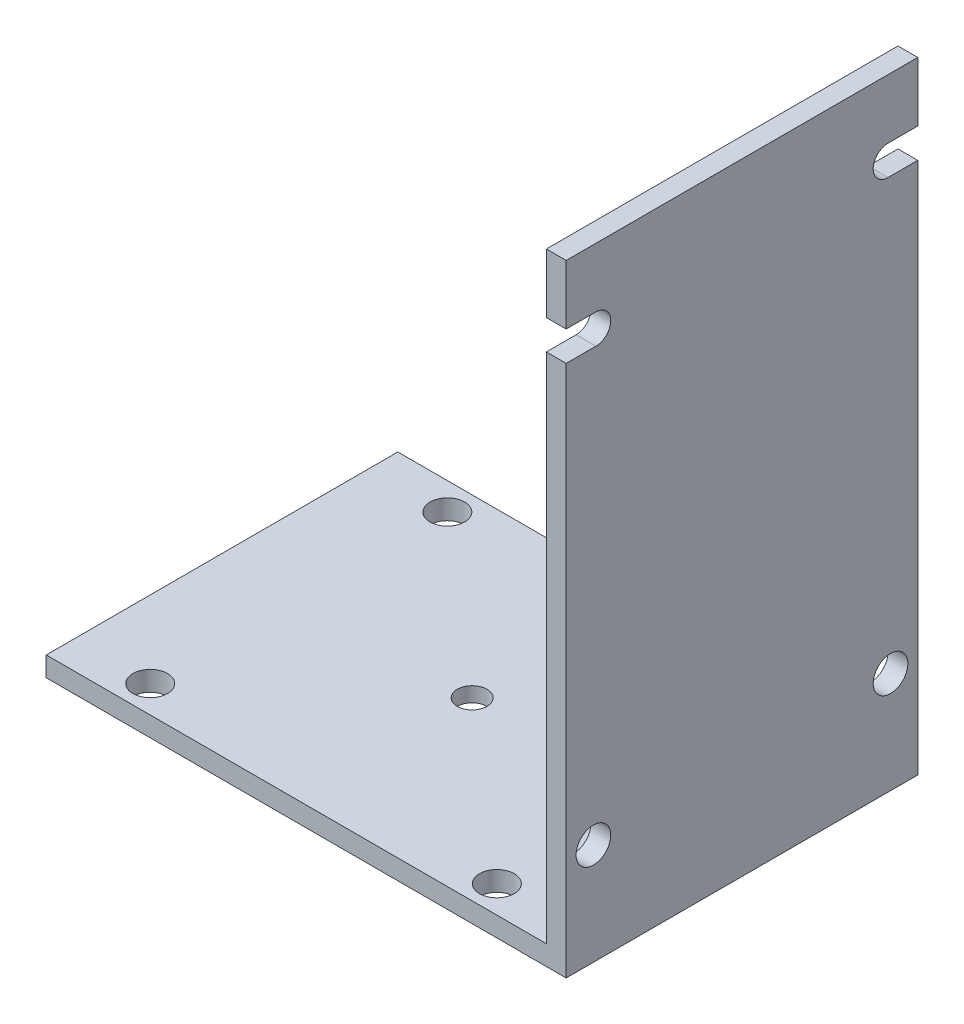
ISO-10303-21;
HEADER;
FILE_DESCRIPTION(('STEP AP214'),'2;1');
FILE_NAME('part.step','',(''),(''),'','','');
FILE_SCHEMA(('AUTOMOTIVE_DESIGN { 1 0 10303 214 1 1 1 1 }'));
ENDSEC;
DATA;
#1=APPLICATION_CONTEXT('core data for automotive mechanical design processes');
#2=APPLICATION_PROTOCOL_DEFINITION('international standard','automotive_design',2000,#1);
#3=PRODUCT_CONTEXT('',#1,'mechanical');
#4=PRODUCT('Part','Part','',(#3));
#5=PRODUCT_RELATED_PRODUCT_CATEGORY('part','',(#4));
#6=PRODUCT_DEFINITION_FORMATION('','',#4);
#7=PRODUCT_DEFINITION_CONTEXT('part definition',#1,'design');
#8=PRODUCT_DEFINITION('design','',#6,#7);
#9=PRODUCT_DEFINITION_SHAPE('','',#8);
#10=(LENGTH_UNIT() NAMED_UNIT(*) SI_UNIT(.MILLI.,.METRE.));
#11=(NAMED_UNIT(*) PLANE_ANGLE_UNIT() SI_UNIT($,.RADIAN.));
#12=(NAMED_UNIT(*) SI_UNIT($,.STERADIAN.) SOLID_ANGLE_UNIT());
#13=UNCERTAINTY_MEASURE_WITH_UNIT(LENGTH_MEASURE(1.E-05),#10,'distance_accuracy_value','');
#14=(GEOMETRIC_REPRESENTATION_CONTEXT(3) GLOBAL_UNCERTAINTY_ASSIGNED_CONTEXT((#13)) GLOBAL_UNIT_ASSIGNED_CONTEXT((#10,
#11,#12)) REPRESENTATION_CONTEXT('',''));
#15=CARTESIAN_POINT('',(0.,0.,0.));
#16=DIRECTION('',(0.,0.,1.));
#17=DIRECTION('',(1.,0.,0.));
#18=AXIS2_PLACEMENT_3D('',#15,#16,#17);
#19=CARTESIAN_POINT('',(5.22062774814458,-8.48528137423857,0.500000000000007));
#20=DIRECTION('',(0.,1.,0.));
#21=DIRECTION('',(0.,0.,1.));
#22=AXIS2_PLACEMENT_3D('',#19,#20,#21);
#23=CYLINDRICAL_SURFACE('',#22,3.);
#24=CARTESIAN_POINT('',(5.22062774814458,4.,0.500000000000007));
#25=DIRECTION('',(0.,1.,0.));
#26=DIRECTION('',(0.,0.,1.));
#27=AXIS2_PLACEMENT_3D('',#24,#25,#26);
#28=CIRCLE('',#27,3.);
#29=CARTESIAN_POINT('',(5.22062774814458,4.,3.50000000000001));
#30=VERTEX_POINT('',#29);
#31=EDGE_CURVE('E357',#30,#30,#28,.T.);
#32=CARTESIAN_POINT('',(5.22062774814458,1.,0.500000000000007));
#33=DIRECTION('',(0.,-1.,0.));
#34=DIRECTION('',(0.,0.,-1.));
#35=AXIS2_PLACEMENT_3D('',#32,#33,#34);
#36=CIRCLE('',#35,3.);
#37=CARTESIAN_POINT('',(5.22062774814458,1.,3.50000000000001));
#38=VERTEX_POINT('',#37);
#39=EDGE_CURVE('E45',#38,#38,#36,.F.);
#40=CARTESIAN_POINT('',(5.22062774814458,4.,3.50000000000001));
#41=CARTESIAN_POINT('',(5.22062774814458,3.96875,3.50000000000001));
#42=CARTESIAN_POINT('',(5.22062774814458,3.9375,3.50000000000001));
#43=CARTESIAN_POINT('',(5.22062774814458,3.875,3.50000000000001));
#44=CARTESIAN_POINT('',(5.22062774814458,3.84375,3.50000000000001));
#45=CARTESIAN_POINT('',(5.22062774814458,3.78125,3.50000000000001));
#46=CARTESIAN_POINT('',(5.22062774814458,3.75,3.50000000000001));
#47=CARTESIAN_POINT('',(5.22062774814458,3.6875,3.50000000000001));
#48=CARTESIAN_POINT('',(5.22062774814458,3.65625,3.50000000000001));
#49=CARTESIAN_POINT('',(5.22062774814458,3.59375,3.50000000000001));
#50=CARTESIAN_POINT('',(5.22062774814458,3.5625,3.50000000000001));
#51=CARTESIAN_POINT('',(5.22062774814458,3.5,3.50000000000001));
#52=CARTESIAN_POINT('',(5.22062774814458,3.46875,3.50000000000001));
#53=CARTESIAN_POINT('',(5.22062774814458,3.40625,3.50000000000001));
#54=CARTESIAN_POINT('',(5.22062774814458,3.375,3.50000000000001));
#55=CARTESIAN_POINT('',(5.22062774814458,3.3125,3.50000000000001));
#56=CARTESIAN_POINT('',(5.22062774814458,3.28125,3.50000000000001));
#57=CARTESIAN_POINT('',(5.22062774814458,3.21875,3.50000000000001));
#58=CARTESIAN_POINT('',(5.22062774814458,3.1875,3.50000000000001));
#59=CARTESIAN_POINT('',(5.22062774814458,3.125,3.50000000000001));
#60=CARTESIAN_POINT('',(5.22062774814458,3.09375,3.50000000000001));
#61=CARTESIAN_POINT('',(5.22062774814458,3.03125,3.50000000000001));
#62=CARTESIAN_POINT('',(5.22062774814458,3.,3.50000000000001));
#63=CARTESIAN_POINT('',(5.22062774814458,2.9375,3.50000000000001));
#64=CARTESIAN_POINT('',(5.22062774814458,2.90625,3.50000000000001));
#65=CARTESIAN_POINT('',(5.22062774814458,2.84375,3.50000000000001));
#66=CARTESIAN_POINT('',(5.22062774814458,2.8125,3.50000000000001));
#67=CARTESIAN_POINT('',(5.22062774814458,2.75,3.50000000000001));
#68=CARTESIAN_POINT('',(5.22062774814458,2.71875,3.50000000000001));
#69=CARTESIAN_POINT('',(5.22062774814458,2.65625,3.50000000000001));
#70=CARTESIAN_POINT('',(5.22062774814458,2.625,3.50000000000001));
#71=CARTESIAN_POINT('',(5.22062774814458,2.5625,3.50000000000001));
#72=CARTESIAN_POINT('',(5.22062774814458,2.53125,3.50000000000001));
#73=CARTESIAN_POINT('',(5.22062774814458,2.46875,3.50000000000001));
#74=CARTESIAN_POINT('',(5.22062774814458,2.4375,3.50000000000001));
#75=CARTESIAN_POINT('',(5.22062774814458,2.375,3.50000000000001));
#76=CARTESIAN_POINT('',(5.22062774814458,2.34375,3.50000000000001));
#77=CARTESIAN_POINT('',(5.22062774814458,2.28125,3.50000000000001));
#78=CARTESIAN_POINT('',(5.22062774814458,2.25,3.50000000000001));
#79=CARTESIAN_POINT('',(5.22062774814458,2.1875,3.50000000000001));
#80=CARTESIAN_POINT('',(5.22062774814458,2.15625,3.50000000000001));
#81=CARTESIAN_POINT('',(5.22062774814458,2.09375,3.50000000000001));
#82=CARTESIAN_POINT('',(5.22062774814458,2.0625,3.50000000000001));
#83=CARTESIAN_POINT('',(5.22062774814458,2.,3.50000000000001));
#84=CARTESIAN_POINT('',(5.22062774814458,1.96875,3.50000000000001));
#85=CARTESIAN_POINT('',(5.22062774814458,1.90625,3.50000000000001));
#86=CARTESIAN_POINT('',(5.22062774814458,1.875,3.50000000000001));
#87=CARTESIAN_POINT('',(5.22062774814458,1.8125,3.50000000000001));
#88=CARTESIAN_POINT('',(5.22062774814458,1.78125,3.50000000000001));
#89=CARTESIAN_POINT('',(5.22062774814458,1.71875,3.50000000000001));
#90=CARTESIAN_POINT('',(5.22062774814458,1.6875,3.50000000000001));
#91=CARTESIAN_POINT('',(5.22062774814458,1.625,3.50000000000001));
#92=CARTESIAN_POINT('',(5.22062774814458,1.59375,3.50000000000001));
#93=CARTESIAN_POINT('',(5.22062774814458,1.53125,3.50000000000001));
#94=CARTESIAN_POINT('',(5.22062774814458,1.5,3.50000000000001));
#95=CARTESIAN_POINT('',(5.22062774814458,1.4375,3.50000000000001));
#96=CARTESIAN_POINT('',(5.22062774814458,1.40625,3.50000000000001));
#97=CARTESIAN_POINT('',(5.22062774814458,1.34375,3.50000000000001));
#98=CARTESIAN_POINT('',(5.22062774814458,1.3125,3.50000000000001));
#99=CARTESIAN_POINT('',(5.22062774814458,1.25,3.50000000000001));
#100=CARTESIAN_POINT('',(5.22062774814458,1.21875,3.50000000000001));
#101=CARTESIAN_POINT('',(5.22062774814458,1.15625,3.50000000000001));
#102=CARTESIAN_POINT('',(5.22062774814458,1.125,3.50000000000001));
#103=CARTESIAN_POINT('',(5.22062774814458,1.0625,3.50000000000001));
#104=CARTESIAN_POINT('',(5.22062774814458,1.03125,3.50000000000001));
#105=CARTESIAN_POINT('',(5.22062774814458,1.,3.50000000000001));
#106=B_SPLINE_CURVE_WITH_KNOTS('',3,(#40,#41,#42,#43,#44,#45,#46,#47,#48,#49,#50,#51,#52,#53,
#54,#55,#56,#57,#58,#59,#60,#61,#62,#63,#64,#65,#66,#67,#68,#69,#70,#71,#72,#73,#74,#75,#76,#77,
#78,#79,#80,#81,#82,#83,#84,#85,#86,#87,#88,#89,#90,#91,#92,#93,#94,#95,#96,#97,#98,#99,#100,
#101,#102,#103,#104,#105),.UNSPECIFIED.,.F.,.F.,(4,2,2,2,2,2,2,2,2,2,2,2,2,2,2,2,2,2,2,2,2,2,2,
2,2,2,2,2,2,2,2,2,4),(0.,0.0937500000000001,0.1875,0.28125,0.375,0.468749999999999,
0.562499999999999,0.656249999999999,0.749999999999999,0.843749999999999,0.937499999999999,
1.03125,1.125,1.21875,1.3125,1.40625,1.5,1.59375,1.6875,1.78125,1.875,1.96875,2.0625,2.15625,
2.25,2.34375,2.4375,2.53125,2.625,2.71875,2.8125,2.90625,3.),.UNSPECIFIED.);
#107=EDGE_CURVE('BSEAM41',#30,#38,#106,.T.);
#108=ORIENTED_EDGE('',*,*,#31,.T.);
#109=ORIENTED_EDGE('',*,*,#39,.F.);
#110=ORIENTED_EDGE('',*,*,#107,.T.);
#111=ORIENTED_EDGE('',*,*,#107,.F.);
#112=EDGE_LOOP('',(#108,#110,#109,#111));
#113=FACE_BOUND('',#112,.T.);
#114=ADVANCED_FACE('F41',(#113),#23,.F.);
#115=CARTESIAN_POINT('',(0.,4.,-35.));
#116=DIRECTION('',(0.,0.,-1.));
#117=DIRECTION('',(-1.,0.,0.));
#118=AXIS2_PLACEMENT_3D('',#115,#116,#117);
#119=PLANE('',#118);
#120=DIRECTION('',(0.,-1.,0.));
#121=VECTOR('',#120,1.);
#122=CARTESIAN_POINT('',(59.7206277481446,125.5,-35.));
#123=LINE('',#122,#121);
#124=CARTESIAN_POINT('',(59.7206277481446,125.5,-35.));
#125=VERTEX_POINT('',#124);
#126=CARTESIAN_POINT('',(59.7206277481446,113.5,-35.));
#127=VERTEX_POINT('',#126);
#128=EDGE_CURVE('E250',#125,#127,#123,.T.);
#129=ORIENTED_EDGE('',*,*,#128,.T.);
#130=DIRECTION('',(-1.,0.,0.));
#131=VECTOR('',#130,1.);
#132=CARTESIAN_POINT('',(70.5372815745366,113.5,-35.));
#133=LINE('',#132,#131);
#134=CARTESIAN_POINT('',(55.7206277481446,113.5,-35.));
#135=VERTEX_POINT('',#134);
#136=EDGE_CURVE('E216',#127,#135,#133,.T.);
#137=ORIENTED_EDGE('',*,*,#136,.T.);
#138=DIRECTION('',(0.,-1.,0.));
#139=VECTOR('',#138,1.);
#140=CARTESIAN_POINT('',(55.7206277481446,125.5,-35.));
#141=LINE('',#140,#139);
#142=CARTESIAN_POINT('',(55.7206277481446,125.5,-35.));
#143=VERTEX_POINT('',#142);
#144=EDGE_CURVE('E245',#143,#135,#141,.T.);
#145=ORIENTED_EDGE('',*,*,#144,.F.);
#146=DIRECTION('',(-1.,0.,0.));
#147=VECTOR('',#146,1.);
#148=CARTESIAN_POINT('',(55.7206277481446,125.5,-35.));
#149=LINE('',#148,#147);
#150=EDGE_CURVE('E238',#125,#143,#149,.T.);
#151=ORIENTED_EDGE('',*,*,#150,.F.);
#152=EDGE_LOOP('',(#129,#137,#145,#151));
#153=FACE_BOUND('',#152,.T.);
#154=ADVANCED_FACE('F377',(#153),#119,.T.);
#155=CARTESIAN_POINT('',(0.,4.,36.));
#156=DIRECTION('',(0.,0.,-1.));
#157=DIRECTION('',(-1.,0.,0.));
#158=AXIS2_PLACEMENT_3D('',#155,#156,#157);
#159=PLANE('',#158);
#160=DIRECTION('',(-1.,0.,0.));
#161=VECTOR('',#160,1.);
#162=CARTESIAN_POINT('',(70.5372815745366,107.5,36.));
#163=LINE('',#162,#161);
#164=CARTESIAN_POINT('',(59.7206277481446,107.5,36.));
#165=VERTEX_POINT('',#164);
#166=CARTESIAN_POINT('',(55.7206277481446,107.5,36.));
#167=VERTEX_POINT('',#166);
#168=EDGE_CURVE('E175',#165,#167,#163,.T.);
#169=ORIENTED_EDGE('',*,*,#168,.T.);
#170=DIRECTION('',(0.,-1.,0.));
#171=VECTOR('',#170,1.);
#172=CARTESIAN_POINT('',(55.7206277481446,125.5,36.));
#173=LINE('',#172,#171);
#174=CARTESIAN_POINT('',(55.7206277481446,4.,36.));
#175=VERTEX_POINT('',#174);
#176=EDGE_CURVE('E259',#167,#175,#173,.T.);
#177=ORIENTED_EDGE('',*,*,#176,.T.);
#178=DIRECTION('',(1.,0.,0.));
#179=VECTOR('',#178,1.);
#180=CARTESIAN_POINT('',(0.,4.,36.));
#181=LINE('',#180,#179);
#182=CARTESIAN_POINT('',(-45.2793722518554,4.,36.));
#183=VERTEX_POINT('',#182);
#184=EDGE_CURVE('E272',#183,#175,#181,.T.);
#185=ORIENTED_EDGE('',*,*,#184,.F.);
#186=DIRECTION('',(0.,-1.,0.));
#187=VECTOR('',#186,1.);
#188=CARTESIAN_POINT('',(-45.2793722518554,4.,36.));
#189=LINE('',#188,#187);
#190=CARTESIAN_POINT('',(-45.2793722518554,0.,36.));
#191=VERTEX_POINT('',#190);
#192=EDGE_CURVE('E51',#183,#191,#189,.T.);
#193=ORIENTED_EDGE('',*,*,#192,.T.);
#194=DIRECTION('',(1.,0.,0.));
#195=VECTOR('',#194,1.);
#196=CARTESIAN_POINT('',(0.,0.,36.));
#197=LINE('',#196,#195);
#198=CARTESIAN_POINT('',(59.7206277481446,0.,36.));
#199=VERTEX_POINT('',#198);
#200=EDGE_CURVE('E302',#191,#199,#197,.T.);
#201=ORIENTED_EDGE('',*,*,#200,.T.);
#202=DIRECTION('',(0.,-1.,0.));
#203=VECTOR('',#202,1.);
#204=CARTESIAN_POINT('',(59.7206277481446,125.5,36.));
#205=LINE('',#204,#203);
#206=EDGE_CURVE('E254',#165,#199,#205,.T.);
#207=ORIENTED_EDGE('',*,*,#206,.F.);
#208=EDGE_LOOP('',(#169,#177,#185,#193,#201,#207));
#209=FACE_BOUND('',#208,.T.);
#210=ADVANCED_FACE('F327',(#209),#159,.F.);
#211=CARTESIAN_POINT('',(55.7206277481446,125.5,-35.));
#212=DIRECTION('',(1.,0.,0.));
#213=DIRECTION('',(0.,0.,-1.));
#214=AXIS2_PLACEMENT_3D('',#211,#212,#213);
#215=PLANE('',#214);
#216=CARTESIAN_POINT('',(55.7206277481446,20.5,-29.5));
#217=DIRECTION('',(1.,0.,0.));
#218=DIRECTION('',(0.,0.,-1.));
#219=AXIS2_PLACEMENT_3D('',#216,#217,#218);
#220=CIRCLE('',#219,3.5);
#221=CARTESIAN_POINT('',(55.7206277481446,20.5,-33.));
#222=VERTEX_POINT('',#221);
#223=EDGE_CURVE('E184',#222,#222,#220,.T.);
#224=ORIENTED_EDGE('',*,*,#223,.T.);
#225=EDGE_LOOP('',(#224));
#226=FACE_BOUND('',#225,.T.);
#227=CARTESIAN_POINT('',(55.7206277481446,20.5,30.5));
#228=DIRECTION('',(1.,0.,0.));
#229=DIRECTION('',(0.,0.,-1.));
#230=AXIS2_PLACEMENT_3D('',#227,#228,#229);
#231=CIRCLE('',#230,3.5);
#232=CARTESIAN_POINT('',(55.7206277481446,20.5,27.));
#233=VERTEX_POINT('',#232);
#234=EDGE_CURVE('E353',#233,#233,#231,.T.);
#235=ORIENTED_EDGE('',*,*,#234,.T.);
#236=EDGE_LOOP('',(#235));
#237=FACE_BOUND('',#236,.T.);
#238=DIRECTION('',(0.,0.,-1.));
#239=VECTOR('',#238,1.);
#240=CARTESIAN_POINT('',(55.7206277481446,107.5,-35.));
#241=LINE('',#240,#239);
#242=CARTESIAN_POINT('',(55.7206277481446,107.5,30.));
#243=VERTEX_POINT('',#242);
#244=EDGE_CURVE('E152',#167,#243,#241,.T.);
#245=ORIENTED_EDGE('',*,*,#244,.T.);
#246=CARTESIAN_POINT('',(55.7206277481446,110.5,30.));
#247=DIRECTION('',(1.,0.,0.));
#248=DIRECTION('',(0.,0.,-1.));
#249=AXIS2_PLACEMENT_3D('',#246,#247,#248);
#250=CIRCLE('',#249,3.);
#251=CARTESIAN_POINT('',(55.7206277481446,113.5,30.));
#252=VERTEX_POINT('',#251);
#253=EDGE_CURVE('E145',#243,#252,#250,.T.);
#254=ORIENTED_EDGE('',*,*,#253,.T.);
#255=DIRECTION('',(0.,0.,-1.));
#256=VECTOR('',#255,1.);
#257=CARTESIAN_POINT('',(55.7206277481446,113.5,-35.));
#258=LINE('',#257,#256);
#259=CARTESIAN_POINT('',(55.7206277481446,113.5,36.));
#260=VERTEX_POINT('',#259);
#261=EDGE_CURVE('E155',#260,#252,#258,.T.);
#262=ORIENTED_EDGE('',*,*,#261,.F.);
#263=CARTESIAN_POINT('',(55.7206277481446,125.5,36.));
#264=VERTEX_POINT('',#263);
#265=EDGE_CURVE('E260',#264,#260,#173,.T.);
#266=ORIENTED_EDGE('',*,*,#265,.F.);
#267=DIRECTION('',(0.,0.,1.));
#268=VECTOR('',#267,1.);
#269=CARTESIAN_POINT('',(55.7206277481446,125.5,-35.));
#270=LINE('',#269,#268);
#271=EDGE_CURVE('E228',#143,#264,#270,.T.);
#272=ORIENTED_EDGE('',*,*,#271,.F.);
#273=ORIENTED_EDGE('',*,*,#144,.T.);
#274=DIRECTION('',(0.,0.,1.));
#275=VECTOR('',#274,1.);
#276=CARTESIAN_POINT('',(55.7206277481446,113.5,-35.));
#277=LINE('',#276,#275);
#278=CARTESIAN_POINT('',(55.7206277481446,113.5,-29.));
#279=VERTEX_POINT('',#278);
#280=EDGE_CURVE('E209',#135,#279,#277,.T.);
#281=ORIENTED_EDGE('',*,*,#280,.T.);
#282=CARTESIAN_POINT('',(55.7206277481446,110.5,-29.));
#283=DIRECTION('',(1.,0.,0.));
#284=DIRECTION('',(0.,0.,-1.));
#285=AXIS2_PLACEMENT_3D('',#282,#283,#284);
#286=CIRCLE('',#285,3.);
#287=CARTESIAN_POINT('',(55.7206277481446,107.5,-29.));
#288=VERTEX_POINT('',#287);
#289=EDGE_CURVE('E204',#279,#288,#286,.T.);
#290=ORIENTED_EDGE('',*,*,#289,.T.);
#291=DIRECTION('',(0.,0.,1.));
#292=VECTOR('',#291,1.);
#293=CARTESIAN_POINT('',(55.7206277481446,107.5,-35.));
#294=LINE('',#293,#292);
#295=CARTESIAN_POINT('',(55.7206277481446,107.5,-35.));
#296=VERTEX_POINT('',#295);
#297=EDGE_CURVE('E201',#296,#288,#294,.T.);
#298=ORIENTED_EDGE('',*,*,#297,.F.);
#299=CARTESIAN_POINT('',(55.7206277481446,4.,-35.));
#300=VERTEX_POINT('',#299);
#301=EDGE_CURVE('E241',#296,#300,#141,.T.);
#302=ORIENTED_EDGE('',*,*,#301,.T.);
#303=DIRECTION('',(0.,0.,1.));
#304=VECTOR('',#303,1.);
#305=CARTESIAN_POINT('',(55.7206277481446,4.,0.));
#306=LINE('',#305,#304);
#307=EDGE_CURVE('E276',#300,#175,#306,.T.);
#308=ORIENTED_EDGE('',*,*,#307,.T.);
#309=ORIENTED_EDGE('',*,*,#176,.F.);
#310=EDGE_LOOP('',(#245,#254,#262,#266,#272,#273,#281,#290,#298,#302,#308,#309));
#311=FACE_BOUND('',#310,.T.);
#312=ADVANCED_FACE('F165',(#226,#237,#311),#215,.F.);
#313=CARTESIAN_POINT('',(59.7206277481446,125.5,-35.));
#314=DIRECTION('',(-1.,0.,0.));
#315=DIRECTION('',(0.,0.,1.));
#316=AXIS2_PLACEMENT_3D('',#313,#314,#315);
#317=PLANE('',#316);
#318=CARTESIAN_POINT('',(59.7206277481446,20.5,-29.5));
#319=DIRECTION('',(-1.,0.,0.));
#320=DIRECTION('',(0.,0.,1.));
#321=AXIS2_PLACEMENT_3D('',#318,#319,#320);
#322=CIRCLE('',#321,3.5);
#323=CARTESIAN_POINT('',(59.7206277481446,20.5,-26.));
#324=VERTEX_POINT('',#323);
#325=EDGE_CURVE('E163',#324,#324,#322,.T.);
#326=ORIENTED_EDGE('',*,*,#325,.T.);
#327=EDGE_LOOP('',(#326));
#328=FACE_BOUND('',#327,.T.);
#329=CARTESIAN_POINT('',(59.7206277481446,20.5,30.5));
#330=DIRECTION('',(-1.,0.,0.));
#331=DIRECTION('',(0.,0.,1.));
#332=AXIS2_PLACEMENT_3D('',#329,#330,#331);
#333=CIRCLE('',#332,3.5);
#334=CARTESIAN_POINT('',(59.7206277481446,20.5,34.));
#335=VERTEX_POINT('',#334);
#336=EDGE_CURVE('E188',#335,#335,#333,.T.);
#337=ORIENTED_EDGE('',*,*,#336,.T.);
#338=EDGE_LOOP('',(#337));
#339=FACE_BOUND('',#338,.T.);
#340=DIRECTION('',(0.,0.,1.));
#341=VECTOR('',#340,1.);
#342=CARTESIAN_POINT('',(59.7206277481446,107.5,-35.));
#343=LINE('',#342,#341);
#344=CARTESIAN_POINT('',(59.7206277481446,107.5,30.));
#345=VERTEX_POINT('',#344);
#346=EDGE_CURVE('E183',#345,#165,#343,.T.);
#347=ORIENTED_EDGE('',*,*,#346,.T.);
#348=ORIENTED_EDGE('',*,*,#206,.T.);
#349=DIRECTION('',(0.,0.,-1.));
#350=VECTOR('',#349,1.);
#351=CARTESIAN_POINT('',(59.7206277481446,0.,-35.));
#352=LINE('',#351,#350);
#353=CARTESIAN_POINT('',(59.7206277481446,0.,-35.));
#354=VERTEX_POINT('',#353);
#355=EDGE_CURVE('E200',#199,#354,#352,.T.);
#356=ORIENTED_EDGE('',*,*,#355,.T.);
#357=CARTESIAN_POINT('',(59.7206277481446,107.5,-35.));
#358=VERTEX_POINT('',#357);
#359=EDGE_CURVE('E249',#358,#354,#123,.T.);
#360=ORIENTED_EDGE('',*,*,#359,.F.);
#361=DIRECTION('',(0.,0.,-1.));
#362=VECTOR('',#361,1.);
#363=CARTESIAN_POINT('',(59.7206277481446,107.5,-35.));
#364=LINE('',#363,#362);
#365=CARTESIAN_POINT('',(59.7206277481446,107.5,-29.));
#366=VERTEX_POINT('',#365);
#367=EDGE_CURVE('E196',#366,#358,#364,.T.);
#368=ORIENTED_EDGE('',*,*,#367,.F.);
#369=CARTESIAN_POINT('',(59.7206277481446,110.5,-29.));
#370=DIRECTION('',(-1.,0.,0.));
#371=DIRECTION('',(0.,0.,1.));
#372=AXIS2_PLACEMENT_3D('',#369,#370,#371);
#373=CIRCLE('',#372,3.);
#374=CARTESIAN_POINT('',(59.7206277481446,113.5,-29.));
#375=VERTEX_POINT('',#374);
#376=EDGE_CURVE('E197',#366,#375,#373,.T.);
#377=ORIENTED_EDGE('',*,*,#376,.T.);
#378=DIRECTION('',(0.,0.,-1.));
#379=VECTOR('',#378,1.);
#380=CARTESIAN_POINT('',(59.7206277481446,113.5,-35.));
#381=LINE('',#380,#379);
#382=EDGE_CURVE('E192',#375,#127,#381,.T.);
#383=ORIENTED_EDGE('',*,*,#382,.T.);
#384=ORIENTED_EDGE('',*,*,#128,.F.);
#385=DIRECTION('',(0.,0.,-1.));
#386=VECTOR('',#385,1.);
#387=CARTESIAN_POINT('',(59.7206277481446,125.5,-35.));
#388=LINE('',#387,#386);
#389=CARTESIAN_POINT('',(59.7206277481446,125.5,36.));
#390=VERTEX_POINT('',#389);
#391=EDGE_CURVE('E235',#390,#125,#388,.T.);
#392=ORIENTED_EDGE('',*,*,#391,.F.);
#393=CARTESIAN_POINT('',(59.7206277481446,113.5,36.));
#394=VERTEX_POINT('',#393);
#395=EDGE_CURVE('E255',#390,#394,#205,.T.);
#396=ORIENTED_EDGE('',*,*,#395,.T.);
#397=DIRECTION('',(0.,0.,1.));
#398=VECTOR('',#397,1.);
#399=CARTESIAN_POINT('',(59.7206277481446,113.5,-35.));
#400=LINE('',#399,#398);
#401=CARTESIAN_POINT('',(59.7206277481446,113.5,30.));
#402=VERTEX_POINT('',#401);
#403=EDGE_CURVE('E205',#402,#394,#400,.T.);
#404=ORIENTED_EDGE('',*,*,#403,.F.);
#405=CARTESIAN_POINT('',(59.7206277481446,110.5,30.));
#406=DIRECTION('',(-1.,0.,0.));
#407=DIRECTION('',(0.,0.,1.));
#408=AXIS2_PLACEMENT_3D('',#405,#406,#407);
#409=CIRCLE('',#408,3.);
#410=EDGE_CURVE('E148',#402,#345,#409,.T.);
#411=ORIENTED_EDGE('',*,*,#410,.T.);
#412=EDGE_LOOP('',(#347,#348,#356,#360,#368,#377,#383,#384,#392,#396,#404,#411));
#413=FACE_BOUND('',#412,.T.);
#414=ADVANCED_FACE('F340',(#328,#339,#413),#317,.F.);
#415=DIRECTION('',(-1.,0.,0.));
#416=VECTOR('',#415,1.);
#417=CARTESIAN_POINT('',(70.5372815745366,107.5,-35.));
#418=LINE('',#417,#416);
#419=EDGE_CURVE('E213',#358,#296,#418,.T.);
#420=ORIENTED_EDGE('',*,*,#419,.F.);
#421=ORIENTED_EDGE('',*,*,#359,.T.);
#422=DIRECTION('',(1.,0.,0.));
#423=VECTOR('',#422,1.);
#424=CARTESIAN_POINT('',(0.,0.,-35.));
#425=LINE('',#424,#423);
#426=CARTESIAN_POINT('',(-45.2793722518554,0.,-35.));
#427=VERTEX_POINT('',#426);
#428=EDGE_CURVE('E263',#427,#354,#425,.T.);
#429=ORIENTED_EDGE('',*,*,#428,.F.);
#430=DIRECTION('',(0.,-1.,0.));
#431=VECTOR('',#430,1.);
#432=CARTESIAN_POINT('',(-45.2793722518554,4.,-35.));
#433=LINE('',#432,#431);
#434=CARTESIAN_POINT('',(-45.2793722518554,4.,-35.));
#435=VERTEX_POINT('',#434);
#436=EDGE_CURVE('E11',#435,#427,#433,.T.);
#437=ORIENTED_EDGE('',*,*,#436,.F.);
#438=DIRECTION('',(1.,0.,0.));
#439=VECTOR('',#438,1.);
#440=CARTESIAN_POINT('',(0.,4.,-35.));
#441=LINE('',#440,#439);
#442=EDGE_CURVE('E264',#435,#300,#441,.T.);
#443=ORIENTED_EDGE('',*,*,#442,.T.);
#444=ORIENTED_EDGE('',*,*,#301,.F.);
#445=EDGE_LOOP('',(#420,#421,#429,#437,#443,#444));
#446=FACE_BOUND('',#445,.T.);
#447=ADVANCED_FACE('F43',(#446),#119,.T.);
#448=CARTESIAN_POINT('',(-45.2793722518554,4.,0.));
#449=DIRECTION('',(1.,0.,0.));
#450=DIRECTION('',(0.,0.,-1.));
#451=AXIS2_PLACEMENT_3D('',#448,#449,#450);
#452=PLANE('',#451);
#453=DIRECTION('',(0.,0.,1.));
#454=VECTOR('',#453,1.);
#455=CARTESIAN_POINT('',(-45.2793722518554,0.,0.));
#456=LINE('',#455,#454);
#457=EDGE_CURVE('E299',#427,#191,#456,.T.);
#458=ORIENTED_EDGE('',*,*,#457,.T.);
#459=ORIENTED_EDGE('',*,*,#192,.F.);
#460=DIRECTION('',(0.,0.,1.));
#461=VECTOR('',#460,1.);
#462=CARTESIAN_POINT('',(-45.2793722518554,4.,0.));
#463=LINE('',#462,#461);
#464=EDGE_CURVE('E268',#435,#183,#463,.T.);
#465=ORIENTED_EDGE('',*,*,#464,.F.);
#466=ORIENTED_EDGE('',*,*,#436,.T.);
#467=EDGE_LOOP('',(#458,#459,#465,#466));
#468=FACE_BOUND('',#467,.T.);
#469=ADVANCED_FACE('F450',(#468),#452,.F.);
#470=ORIENTED_EDGE('',*,*,#265,.T.);
#471=DIRECTION('',(-1.,0.,0.));
#472=VECTOR('',#471,1.);
#473=CARTESIAN_POINT('',(70.5372815745366,113.5,36.));
#474=LINE('',#473,#472);
#475=EDGE_CURVE('E158',#394,#260,#474,.T.);
#476=ORIENTED_EDGE('',*,*,#475,.F.);
#477=ORIENTED_EDGE('',*,*,#395,.F.);
#478=DIRECTION('',(1.,0.,0.));
#479=VECTOR('',#478,1.);
#480=CARTESIAN_POINT('',(55.7206277481446,125.5,36.));
#481=LINE('',#480,#479);
#482=EDGE_CURVE('E232',#264,#390,#481,.T.);
#483=ORIENTED_EDGE('',*,*,#482,.F.);
#484=EDGE_LOOP('',(#470,#476,#477,#483));
#485=FACE_BOUND('',#484,.T.);
#486=ADVANCED_FACE('F441',(#485),#159,.F.);
#487=CARTESIAN_POINT('',(-29.7793722518554,4.,30.5));
#488=DIRECTION('',(0.,-1.,0.));
#489=DIRECTION('',(0.,0.,-1.));
#490=AXIS2_PLACEMENT_3D('',#487,#488,#489);
#491=CYLINDRICAL_SURFACE('',#490,3.5);
#492=CARTESIAN_POINT('',(-29.7793722518554,4.,30.5));
#493=DIRECTION('',(0.,1.,0.));
#494=DIRECTION('',(0.,0.,1.));
#495=AXIS2_PLACEMENT_3D('',#492,#493,#494);
#496=CIRCLE('',#495,3.5);
#497=CARTESIAN_POINT('',(-29.7793722518554,4.,34.));
#498=VERTEX_POINT('',#497);
#499=EDGE_CURVE('E288',#498,#498,#496,.T.);
#500=ORIENTED_EDGE('',*,*,#499,.T.);
#501=EDGE_LOOP('',(#500));
#502=FACE_BOUND('',#501,.T.);
#503=CARTESIAN_POINT('',(-29.7793722518554,0.,30.5));
#504=DIRECTION('',(0.,1.,0.));
#505=DIRECTION('',(0.,0.,1.));
#506=AXIS2_PLACEMENT_3D('',#503,#504,#505);
#507=CIRCLE('',#506,3.5);
#508=CARTESIAN_POINT('',(-29.7793722518554,0.,34.));
#509=VERTEX_POINT('',#508);
#510=EDGE_CURVE('E314',#509,#509,#507,.T.);
#511=ORIENTED_EDGE('',*,*,#510,.F.);
#512=EDGE_LOOP('',(#511));
#513=FACE_BOUND('',#512,.T.);
#514=ADVANCED_FACE('F437',(#502,#513),#491,.F.);
#515=CARTESIAN_POINT('',(40.2206277481446,4.,30.5));
#516=DIRECTION('',(0.,-1.,0.));
#517=DIRECTION('',(0.,0.,-1.));
#518=AXIS2_PLACEMENT_3D('',#515,#516,#517);
#519=CYLINDRICAL_SURFACE('',#518,3.5);
#520=CARTESIAN_POINT('',(40.2206277481446,4.,30.5));
#521=DIRECTION('',(0.,1.,0.));
#522=DIRECTION('',(0.,0.,1.));
#523=AXIS2_PLACEMENT_3D('',#520,#521,#522);
#524=CIRCLE('',#523,3.5);
#525=CARTESIAN_POINT('',(40.2206277481446,4.,34.));
#526=VERTEX_POINT('',#525);
#527=EDGE_CURVE('E284',#526,#526,#524,.T.);
#528=ORIENTED_EDGE('',*,*,#527,.T.);
#529=EDGE_LOOP('',(#528));
#530=FACE_BOUND('',#529,.T.);
#531=CARTESIAN_POINT('',(40.2206277481446,0.,30.5));
#532=DIRECTION('',(0.,1.,0.));
#533=DIRECTION('',(0.,0.,1.));
#534=AXIS2_PLACEMENT_3D('',#531,#532,#533);
#535=CIRCLE('',#534,3.5);
#536=CARTESIAN_POINT('',(40.2206277481446,0.,34.));
#537=VERTEX_POINT('',#536);
#538=EDGE_CURVE('E310',#537,#537,#535,.T.);
#539=ORIENTED_EDGE('',*,*,#538,.F.);
#540=EDGE_LOOP('',(#539));
#541=FACE_BOUND('',#540,.T.);
#542=ADVANCED_FACE('F440',(#530,#541),#519,.F.);
#543=CARTESIAN_POINT('',(-29.7793722518555,4.,-29.5));
#544=DIRECTION('',(0.,-1.,0.));
#545=DIRECTION('',(0.,0.,-1.));
#546=AXIS2_PLACEMENT_3D('',#543,#544,#545);
#547=CYLINDRICAL_SURFACE('',#546,3.5);
#548=CARTESIAN_POINT('',(-29.7793722518555,4.,-29.5));
#549=DIRECTION('',(0.,1.,0.));
#550=DIRECTION('',(0.,0.,1.));
#551=AXIS2_PLACEMENT_3D('',#548,#549,#550);
#552=CIRCLE('',#551,3.5);
#553=CARTESIAN_POINT('',(-29.7793722518555,4.,-26.));
#554=VERTEX_POINT('',#553);
#555=EDGE_CURVE('E280',#554,#554,#552,.T.);
#556=ORIENTED_EDGE('',*,*,#555,.T.);
#557=EDGE_LOOP('',(#556));
#558=FACE_BOUND('',#557,.T.);
#559=CARTESIAN_POINT('',(-29.7793722518555,0.,-29.5));
#560=DIRECTION('',(0.,1.,0.));
#561=DIRECTION('',(0.,0.,1.));
#562=AXIS2_PLACEMENT_3D('',#559,#560,#561);
#563=CIRCLE('',#562,3.5);
#564=CARTESIAN_POINT('',(-29.7793722518555,0.,-26.));
#565=VERTEX_POINT('',#564);
#566=EDGE_CURVE('E306',#565,#565,#563,.T.);
#567=ORIENTED_EDGE('',*,*,#566,.F.);
#568=EDGE_LOOP('',(#567));
#569=FACE_BOUND('',#568,.T.);
#570=ADVANCED_FACE('F435',(#558,#569),#547,.F.);
#571=CARTESIAN_POINT('',(40.2206277481446,4.,-29.5));
#572=DIRECTION('',(0.,-1.,0.));
#573=DIRECTION('',(0.,0.,-1.));
#574=AXIS2_PLACEMENT_3D('',#571,#572,#573);
#575=CYLINDRICAL_SURFACE('',#574,3.5);
#576=CARTESIAN_POINT('',(40.2206277481446,4.,-29.5));
#577=DIRECTION('',(0.,1.,0.));
#578=DIRECTION('',(0.,0.,1.));
#579=AXIS2_PLACEMENT_3D('',#576,#577,#578);
#580=CIRCLE('',#579,3.5);
#581=CARTESIAN_POINT('',(40.2206277481446,4.,-26.));
#582=VERTEX_POINT('',#581);
#583=EDGE_CURVE('E292',#582,#582,#580,.T.);
#584=ORIENTED_EDGE('',*,*,#583,.T.);
#585=EDGE_LOOP('',(#584));
#586=FACE_BOUND('',#585,.T.);
#587=CARTESIAN_POINT('',(40.2206277481446,0.,-29.5));
#588=DIRECTION('',(0.,1.,0.));
#589=DIRECTION('',(0.,0.,1.));
#590=AXIS2_PLACEMENT_3D('',#587,#588,#589);
#591=CIRCLE('',#590,3.5);
#592=CARTESIAN_POINT('',(40.2206277481446,0.,-26.));
#593=VERTEX_POINT('',#592);
#594=EDGE_CURVE('E269',#593,#593,#591,.T.);
#595=ORIENTED_EDGE('',*,*,#594,.F.);
#596=EDGE_LOOP('',(#595));
#597=FACE_BOUND('',#596,.T.);
#598=ADVANCED_FACE('F428',(#586,#597),#575,.F.);
#599=CARTESIAN_POINT('',(0.,4.,0.));
#600=DIRECTION('',(0.,1.,0.));
#601=DIRECTION('',(0.,0.,1.));
#602=AXIS2_PLACEMENT_3D('',#599,#600,#601);
#603=PLANE('',#602);
#604=ORIENTED_EDGE('',*,*,#31,.F.);
#605=EDGE_LOOP('',(#604));
#606=FACE_BOUND('',#605,.T.);
#607=ORIENTED_EDGE('',*,*,#442,.F.);
#608=ORIENTED_EDGE('',*,*,#464,.T.);
#609=ORIENTED_EDGE('',*,*,#184,.T.);
#610=ORIENTED_EDGE('',*,*,#307,.F.);
#611=EDGE_LOOP('',(#607,#608,#609,#610));
#612=FACE_BOUND('',#611,.T.);
#613=ORIENTED_EDGE('',*,*,#555,.F.);
#614=EDGE_LOOP('',(#613));
#615=FACE_BOUND('',#614,.T.);
#616=ORIENTED_EDGE('',*,*,#527,.F.);
#617=EDGE_LOOP('',(#616));
#618=FACE_BOUND('',#617,.T.);
#619=ORIENTED_EDGE('',*,*,#499,.F.);
#620=EDGE_LOOP('',(#619));
#621=FACE_BOUND('',#620,.T.);
#622=ORIENTED_EDGE('',*,*,#583,.F.);
#623=EDGE_LOOP('',(#622));
#624=FACE_BOUND('',#623,.T.);
#625=ADVANCED_FACE('F425',(#606,#612,#615,#618,#621,#624),#603,.T.);
#626=CARTESIAN_POINT('',(0.,0.,0.));
#627=DIRECTION('',(0.,1.,0.));
#628=DIRECTION('',(0.,0.,1.));
#629=AXIS2_PLACEMENT_3D('',#626,#627,#628);
#630=PLANE('',#629);
#631=CARTESIAN_POINT('',(5.22062774814458,0.,0.500000000000007));
#632=DIRECTION('',(0.,-1.,0.));
#633=DIRECTION('',(0.,0.,-1.));
#634=AXIS2_PLACEMENT_3D('',#631,#632,#633);
#635=CIRCLE('',#634,12.25);
#636=CARTESIAN_POINT('',(5.22062774814458,0.,-11.75));
#637=VERTEX_POINT('',#636);
#638=EDGE_CURVE('E361',#637,#637,#635,.T.);
#639=ORIENTED_EDGE('',*,*,#638,.F.);
#640=EDGE_LOOP('',(#639));
#641=FACE_BOUND('',#640,.T.);
#642=ORIENTED_EDGE('',*,*,#428,.T.);
#643=ORIENTED_EDGE('',*,*,#355,.F.);
#644=ORIENTED_EDGE('',*,*,#200,.F.);
#645=ORIENTED_EDGE('',*,*,#457,.F.);
#646=EDGE_LOOP('',(#642,#643,#644,#645));
#647=FACE_BOUND('',#646,.T.);
#648=ORIENTED_EDGE('',*,*,#566,.T.);
#649=EDGE_LOOP('',(#648));
#650=FACE_BOUND('',#649,.T.);
#651=ORIENTED_EDGE('',*,*,#538,.T.);
#652=EDGE_LOOP('',(#651));
#653=FACE_BOUND('',#652,.T.);
#654=ORIENTED_EDGE('',*,*,#510,.T.);
#655=EDGE_LOOP('',(#654));
#656=FACE_BOUND('',#655,.T.);
#657=ORIENTED_EDGE('',*,*,#594,.T.);
#658=EDGE_LOOP('',(#657));
#659=FACE_BOUND('',#658,.T.);
#660=ADVANCED_FACE('F334',(#641,#647,#650,#653,#656,#659),#630,.F.);
#661=CARTESIAN_POINT('',(0.,125.5,0.));
#662=DIRECTION('',(0.,1.,0.));
#663=DIRECTION('',(0.,0.,1.));
#664=AXIS2_PLACEMENT_3D('',#661,#662,#663);
#665=PLANE('',#664);
#666=ORIENTED_EDGE('',*,*,#271,.T.);
#667=ORIENTED_EDGE('',*,*,#482,.T.);
#668=ORIENTED_EDGE('',*,*,#391,.T.);
#669=ORIENTED_EDGE('',*,*,#150,.T.);
#670=EDGE_LOOP('',(#666,#667,#668,#669));
#671=FACE_BOUND('',#670,.T.);
#672=ADVANCED_FACE('F412',(#671),#665,.T.);
#673=CARTESIAN_POINT('',(70.5372815745366,110.5,-29.));
#674=DIRECTION('',(-1.,0.,0.));
#675=DIRECTION('',(0.,0.,1.));
#676=AXIS2_PLACEMENT_3D('',#673,#674,#675);
#677=CYLINDRICAL_SURFACE('',#676,3.);
#678=DIRECTION('',(-1.,0.,0.));
#679=VECTOR('',#678,1.);
#680=CARTESIAN_POINT('',(70.5372815745366,107.5,-29.));
#681=LINE('',#680,#679);
#682=EDGE_CURVE('E66',#366,#288,#681,.T.);
#683=ORIENTED_EDGE('',*,*,#682,.T.);
#684=ORIENTED_EDGE('',*,*,#289,.F.);
#685=DIRECTION('',(-1.,0.,0.));
#686=VECTOR('',#685,1.);
#687=CARTESIAN_POINT('',(70.5372815745366,113.5,-29.));
#688=LINE('',#687,#686);
#689=EDGE_CURVE('E220',#375,#279,#688,.T.);
#690=ORIENTED_EDGE('',*,*,#689,.F.);
#691=ORIENTED_EDGE('',*,*,#376,.F.);
#692=EDGE_LOOP('',(#683,#684,#690,#691));
#693=FACE_BOUND('',#692,.T.);
#694=ADVANCED_FACE('F408',(#693),#677,.F.);
#695=CARTESIAN_POINT('',(70.5372815745366,113.5,-35.));
#696=DIRECTION('',(0.,-1.,0.));
#697=DIRECTION('',(0.,0.,-1.));
#698=AXIS2_PLACEMENT_3D('',#695,#696,#697);
#699=PLANE('',#698);
#700=ORIENTED_EDGE('',*,*,#689,.T.);
#701=ORIENTED_EDGE('',*,*,#280,.F.);
#702=ORIENTED_EDGE('',*,*,#136,.F.);
#703=ORIENTED_EDGE('',*,*,#382,.F.);
#704=EDGE_LOOP('',(#700,#701,#702,#703));
#705=FACE_BOUND('',#704,.T.);
#706=ADVANCED_FACE('F405',(#705),#699,.T.);
#707=CARTESIAN_POINT('',(70.5372815745366,107.5,-35.));
#708=DIRECTION('',(0.,-1.,0.));
#709=DIRECTION('',(0.,0.,-1.));
#710=AXIS2_PLACEMENT_3D('',#707,#708,#709);
#711=PLANE('',#710);
#712=ORIENTED_EDGE('',*,*,#367,.T.);
#713=ORIENTED_EDGE('',*,*,#419,.T.);
#714=ORIENTED_EDGE('',*,*,#297,.T.);
#715=ORIENTED_EDGE('',*,*,#682,.F.);
#716=EDGE_LOOP('',(#712,#713,#714,#715));
#717=FACE_BOUND('',#716,.T.);
#718=ADVANCED_FACE('F392',(#717),#711,.F.);
#719=CARTESIAN_POINT('',(70.5372815745366,20.5,30.5));
#720=DIRECTION('',(-1.,0.,0.));
#721=DIRECTION('',(0.,0.,1.));
#722=AXIS2_PLACEMENT_3D('',#719,#720,#721);
#723=CYLINDRICAL_SURFACE('',#722,3.5);
#724=ORIENTED_EDGE('',*,*,#336,.F.);
#725=EDGE_LOOP('',(#724));
#726=FACE_BOUND('',#725,.T.);
#727=ORIENTED_EDGE('',*,*,#234,.F.);
#728=EDGE_LOOP('',(#727));
#729=FACE_BOUND('',#728,.T.);
#730=ADVANCED_FACE('F388',(#726,#729),#723,.F.);
#731=CARTESIAN_POINT('',(70.5372815745366,20.5,-29.5));
#732=DIRECTION('',(-1.,0.,0.));
#733=DIRECTION('',(0.,0.,1.));
#734=AXIS2_PLACEMENT_3D('',#731,#732,#733);
#735=CYLINDRICAL_SURFACE('',#734,3.5);
#736=ORIENTED_EDGE('',*,*,#325,.F.);
#737=EDGE_LOOP('',(#736));
#738=FACE_BOUND('',#737,.T.);
#739=ORIENTED_EDGE('',*,*,#223,.F.);
#740=EDGE_LOOP('',(#739));
#741=FACE_BOUND('',#740,.T.);
#742=ADVANCED_FACE('F391',(#738,#741),#735,.F.);
#743=CARTESIAN_POINT('',(70.5372815745366,110.5,30.));
#744=DIRECTION('',(-1.,0.,0.));
#745=DIRECTION('',(0.,0.,1.));
#746=AXIS2_PLACEMENT_3D('',#743,#744,#745);
#747=CYLINDRICAL_SURFACE('',#746,3.);
#748=DIRECTION('',(-1.,0.,0.));
#749=VECTOR('',#748,1.);
#750=CARTESIAN_POINT('',(70.5372815745366,113.5,30.));
#751=LINE('',#750,#749);
#752=EDGE_CURVE('E58',#402,#252,#751,.T.);
#753=ORIENTED_EDGE('',*,*,#752,.T.);
#754=ORIENTED_EDGE('',*,*,#253,.F.);
#755=DIRECTION('',(-1.,0.,0.));
#756=VECTOR('',#755,1.);
#757=CARTESIAN_POINT('',(70.5372815745366,107.5,30.));
#758=LINE('',#757,#756);
#759=EDGE_CURVE('E151',#345,#243,#758,.T.);
#760=ORIENTED_EDGE('',*,*,#759,.F.);
#761=ORIENTED_EDGE('',*,*,#410,.F.);
#762=EDGE_LOOP('',(#753,#754,#760,#761));
#763=FACE_BOUND('',#762,.T.);
#764=ADVANCED_FACE('F142',(#763),#747,.F.);
#765=CARTESIAN_POINT('',(70.5372815745366,107.5,-35.));
#766=DIRECTION('',(0.,1.,0.));
#767=DIRECTION('',(0.,0.,1.));
#768=AXIS2_PLACEMENT_3D('',#765,#766,#767);
#769=PLANE('',#768);
#770=ORIENTED_EDGE('',*,*,#759,.T.);
#771=ORIENTED_EDGE('',*,*,#244,.F.);
#772=ORIENTED_EDGE('',*,*,#168,.F.);
#773=ORIENTED_EDGE('',*,*,#346,.F.);
#774=EDGE_LOOP('',(#770,#771,#772,#773));
#775=FACE_BOUND('',#774,.T.);
#776=ADVANCED_FACE('F394',(#775),#769,.T.);
#777=CARTESIAN_POINT('',(70.5372815745366,113.5,-35.));
#778=DIRECTION('',(0.,1.,0.));
#779=DIRECTION('',(0.,0.,1.));
#780=AXIS2_PLACEMENT_3D('',#777,#778,#779);
#781=PLANE('',#780);
#782=ORIENTED_EDGE('',*,*,#403,.T.);
#783=ORIENTED_EDGE('',*,*,#475,.T.);
#784=ORIENTED_EDGE('',*,*,#261,.T.);
#785=ORIENTED_EDGE('',*,*,#752,.F.);
#786=EDGE_LOOP('',(#782,#783,#784,#785));
#787=FACE_BOUND('',#786,.T.);
#788=ADVANCED_FACE('F156',(#787),#781,.F.);
#789=CARTESIAN_POINT('',(5.22062774814458,1.,0.500000000000007));
#790=DIRECTION('',(0.,-1.,0.));
#791=DIRECTION('',(0.,0.,-1.));
#792=AXIS2_PLACEMENT_3D('',#789,#790,#791);
#793=PLANE('',#792);
#794=CARTESIAN_POINT('',(5.22062774814458,1.,0.500000000000007));
#795=DIRECTION('',(0.,-1.,0.));
#796=DIRECTION('',(0.,0.,-1.));
#797=AXIS2_PLACEMENT_3D('',#794,#795,#796);
#798=CIRCLE('',#797,12.25);
#799=CARTESIAN_POINT('',(5.22062774814458,1.,-11.75));
#800=VERTEX_POINT('',#799);
#801=EDGE_CURVE('E365',#800,#800,#798,.T.);
#802=ORIENTED_EDGE('',*,*,#801,.T.);
#803=EDGE_LOOP('',(#802));
#804=FACE_BOUND('',#803,.T.);
#805=ORIENTED_EDGE('',*,*,#39,.T.);
#806=EDGE_LOOP('',(#805));
#807=FACE_BOUND('',#806,.T.);
#808=ADVANCED_FACE('F374',(#804,#807),#793,.T.);
#809=CARTESIAN_POINT('',(5.22062774814458,1.,0.500000000000007));
#810=DIRECTION('',(0.,-1.,0.));
#811=DIRECTION('',(0.,0.,-1.));
#812=AXIS2_PLACEMENT_3D('',#809,#810,#811);
#813=CYLINDRICAL_SURFACE('',#812,12.25);
#814=ORIENTED_EDGE('',*,*,#801,.F.);
#815=EDGE_LOOP('',(#814));
#816=FACE_BOUND('',#815,.T.);
#817=ORIENTED_EDGE('',*,*,#638,.T.);
#818=EDGE_LOOP('',(#817));
#819=FACE_BOUND('',#818,.T.);
#820=ADVANCED_FACE('F386',(#816,#819),#813,.F.);
#821=CLOSED_SHELL('',(#114,#154,#210,#312,#414,#447,#469,#486,#514,#542,#570,#598,#625,#660,
#672,#694,#706,#718,#730,#742,#764,#776,#788,#808,#820));
#822=MANIFOLD_SOLID_BREP('B2',#821);
#823=ADVANCED_BREP_SHAPE_REPRESENTATION('',(#18,#822),#14);
#824=SHAPE_DEFINITION_REPRESENTATION(#9,#823);
ENDSEC;
END-ISO-10303-21;
